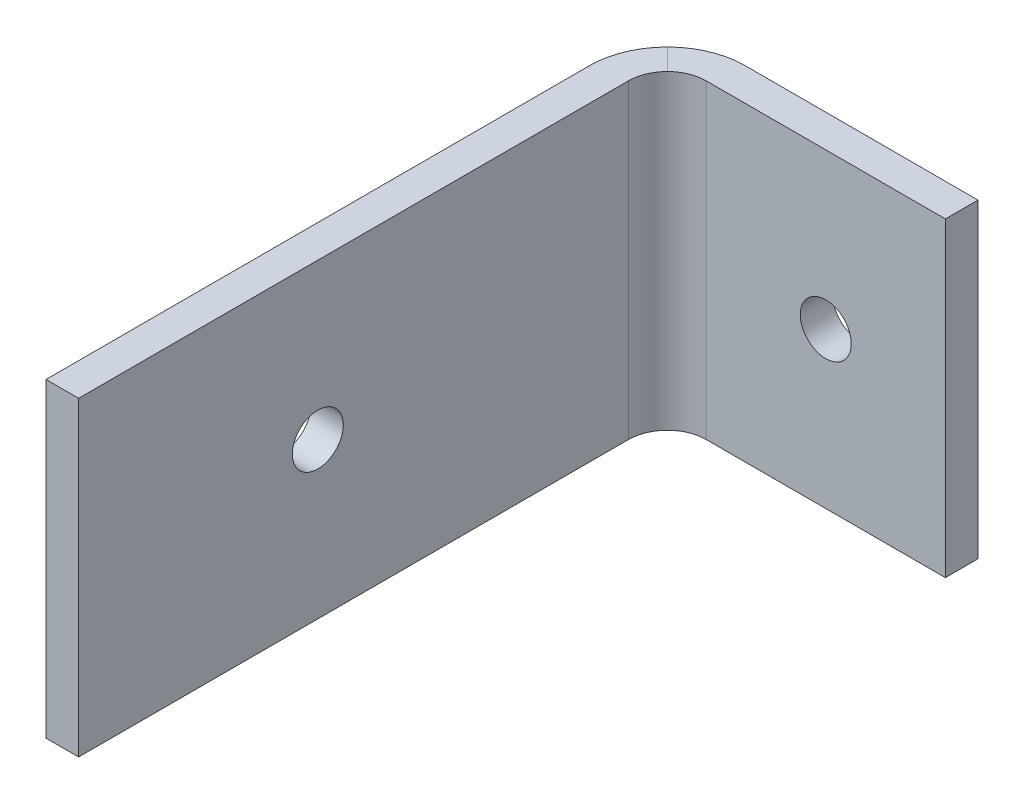
ISO-10303-21;
HEADER;
FILE_DESCRIPTION(('STEP AP214'),'2;1');
FILE_NAME('part.step','',(''),(''),'','','');
FILE_SCHEMA(('AUTOMOTIVE_DESIGN { 1 0 10303 214 1 1 1 1 }'));
ENDSEC;
DATA;
#1=APPLICATION_CONTEXT('core data for automotive mechanical design processes');
#2=APPLICATION_PROTOCOL_DEFINITION('international standard','automotive_design',2000,#1);
#3=PRODUCT_CONTEXT('',#1,'mechanical');
#4=PRODUCT('Part','Part','',(#3));
#5=PRODUCT_RELATED_PRODUCT_CATEGORY('part','',(#4));
#6=PRODUCT_DEFINITION_FORMATION('','',#4);
#7=PRODUCT_DEFINITION_CONTEXT('part definition',#1,'design');
#8=PRODUCT_DEFINITION('design','',#6,#7);
#9=PRODUCT_DEFINITION_SHAPE('','',#8);
#10=(LENGTH_UNIT() NAMED_UNIT(*) SI_UNIT(.MILLI.,.METRE.));
#11=(NAMED_UNIT(*) PLANE_ANGLE_UNIT() SI_UNIT($,.RADIAN.));
#12=(NAMED_UNIT(*) SI_UNIT($,.STERADIAN.) SOLID_ANGLE_UNIT());
#13=UNCERTAINTY_MEASURE_WITH_UNIT(LENGTH_MEASURE(1.E-05),#10,'distance_accuracy_value','');
#14=(GEOMETRIC_REPRESENTATION_CONTEXT(3) GLOBAL_UNCERTAINTY_ASSIGNED_CONTEXT((#13)) GLOBAL_UNIT_ASSIGNED_CONTEXT((#10,
#11,#12)) REPRESENTATION_CONTEXT('',''));
#15=CARTESIAN_POINT('',(0.,0.,0.));
#16=DIRECTION('',(0.,0.,1.));
#17=DIRECTION('',(1.,0.,0.));
#18=AXIS2_PLACEMENT_3D('',#15,#16,#17);
#19=CARTESIAN_POINT('',(25.4,0.,-50.8));
#20=DIRECTION('',(-1.,0.,0.));
#21=DIRECTION('',(0.,0.,1.));
#22=AXIS2_PLACEMENT_3D('',#19,#20,#21);
#23=PLANE('',#22);
#24=DIRECTION('',(0.,1.,0.));
#25=VECTOR('',#24,1.);
#26=CARTESIAN_POINT('',(25.4,-12.7,-48.133));
#27=LINE('',#26,#25);
#28=CARTESIAN_POINT('',(25.4,-12.7,-48.133));
#29=VERTEX_POINT('',#28);
#30=CARTESIAN_POINT('',(25.4,12.7,-48.133));
#31=VERTEX_POINT('',#30);
#32=EDGE_CURVE('E167',#29,#31,#27,.T.);
#33=ORIENTED_EDGE('',*,*,#32,.F.);
#34=DIRECTION('',(0.,0.,1.));
#35=VECTOR('',#34,1.);
#36=CARTESIAN_POINT('',(25.4,-12.7,-48.133));
#37=LINE('',#36,#35);
#38=CARTESIAN_POINT('',(25.4,-12.7,-50.8));
#39=VERTEX_POINT('',#38);
#40=EDGE_CURVE('E153',#39,#29,#37,.T.);
#41=ORIENTED_EDGE('',*,*,#40,.F.);
#42=DIRECTION('',(0.,-1.,0.));
#43=VECTOR('',#42,1.);
#44=CARTESIAN_POINT('',(25.4,-12.7,-50.8));
#45=LINE('',#44,#43);
#46=CARTESIAN_POINT('',(25.4,12.7,-50.8));
#47=VERTEX_POINT('',#46);
#48=EDGE_CURVE('E158',#47,#39,#45,.T.);
#49=ORIENTED_EDGE('',*,*,#48,.F.);
#50=DIRECTION('',(0.,0.,-1.));
#51=VECTOR('',#50,1.);
#52=CARTESIAN_POINT('',(25.4,12.7,-48.133));
#53=LINE('',#52,#51);
#54=EDGE_CURVE('E163',#31,#47,#53,.T.);
#55=ORIENTED_EDGE('',*,*,#54,.F.);
#56=EDGE_LOOP('',(#33,#41,#49,#55));
#57=FACE_BOUND('',#56,.T.);
#58=ADVANCED_FACE('F34',(#57),#23,.F.);
#59=CARTESIAN_POINT('',(0.,0.,0.));
#60=DIRECTION('',(0.,0.,1.));
#61=DIRECTION('',(1.,0.,0.));
#62=AXIS2_PLACEMENT_3D('',#59,#60,#61);
#63=PLANE('',#62);
#64=DIRECTION('',(0.,1.,0.));
#65=VECTOR('',#64,1.);
#66=CARTESIAN_POINT('',(2.667,-12.7,0.));
#67=LINE('',#66,#65);
#68=CARTESIAN_POINT('',(2.667,-12.7,0.));
#69=VERTEX_POINT('',#68);
#70=CARTESIAN_POINT('',(2.667,12.7,0.));
#71=VERTEX_POINT('',#70);
#72=EDGE_CURVE('E144',#69,#71,#67,.T.);
#73=ORIENTED_EDGE('',*,*,#72,.T.);
#74=DIRECTION('',(-1.,0.,0.));
#75=VECTOR('',#74,1.);
#76=CARTESIAN_POINT('',(2.667,12.7,0.));
#77=LINE('',#76,#75);
#78=CARTESIAN_POINT('',(0.,12.7,0.));
#79=VERTEX_POINT('',#78);
#80=EDGE_CURVE('E125',#71,#79,#77,.T.);
#81=ORIENTED_EDGE('',*,*,#80,.T.);
#82=DIRECTION('',(0.,-1.,0.));
#83=VECTOR('',#82,1.);
#84=CARTESIAN_POINT('',(0.,-12.7,0.));
#85=LINE('',#84,#83);
#86=CARTESIAN_POINT('',(0.,-12.7,0.));
#87=VERTEX_POINT('',#86);
#88=EDGE_CURVE('E121',#79,#87,#85,.T.);
#89=ORIENTED_EDGE('',*,*,#88,.T.);
#90=DIRECTION('',(1.,0.,0.));
#91=VECTOR('',#90,1.);
#92=CARTESIAN_POINT('',(2.667,-12.7,0.));
#93=LINE('',#92,#91);
#94=EDGE_CURVE('E112',#87,#69,#93,.T.);
#95=ORIENTED_EDGE('',*,*,#94,.T.);
#96=EDGE_LOOP('',(#73,#81,#89,#95));
#97=FACE_BOUND('',#96,.T.);
#98=ADVANCED_FACE('F124',(#97),#63,.T.);
#99=CARTESIAN_POINT('',(0.,-12.7,-48.133));
#100=DIRECTION('',(0.,0.,-1.));
#101=DIRECTION('',(0.,1.,0.));
#102=AXIS2_PLACEMENT_3D('',#99,#100,#101);
#103=PLANE('',#102);
#104=CARTESIAN_POINT('',(15.621,0.,-48.133));
#105=DIRECTION('',(0.,0.,1.));
#106=DIRECTION('',(1.,0.,0.));
#107=AXIS2_PLACEMENT_3D('',#104,#105,#106);
#108=CIRCLE('',#107,2.0828);
#109=CARTESIAN_POINT('',(17.7038,0.,-48.133));
#110=VERTEX_POINT('',#109);
#111=EDGE_CURVE('E268',#110,#110,#108,.T.);
#112=ORIENTED_EDGE('',*,*,#111,.F.);
#113=EDGE_LOOP('',(#112));
#114=FACE_BOUND('',#113,.T.);
#115=DIRECTION('',(1.,0.,0.));
#116=VECTOR('',#115,1.);
#117=CARTESIAN_POINT('',(0.,12.7,-48.133));
#118=LINE('',#117,#116);
#119=CARTESIAN_POINT('',(5.842,12.7,-48.133));
#120=VERTEX_POINT('',#119);
#121=EDGE_CURVE('E166',#120,#31,#118,.T.);
#122=ORIENTED_EDGE('',*,*,#121,.F.);
#123=DIRECTION('',(0.,-1.,0.));
#124=VECTOR('',#123,1.);
#125=CARTESIAN_POINT('',(5.842,-12.7,-48.133));
#126=LINE('',#125,#124);
#127=CARTESIAN_POINT('',(5.842,-12.7,-48.133));
#128=VERTEX_POINT('',#127);
#129=EDGE_CURVE('E145',#120,#128,#126,.T.);
#130=ORIENTED_EDGE('',*,*,#129,.T.);
#131=DIRECTION('',(1.,0.,0.));
#132=VECTOR('',#131,1.);
#133=CARTESIAN_POINT('',(0.,-12.7,-48.133));
#134=LINE('',#133,#132);
#135=EDGE_CURVE('E149',#128,#29,#134,.T.);
#136=ORIENTED_EDGE('',*,*,#135,.T.);
#137=ORIENTED_EDGE('',*,*,#32,.T.);
#138=EDGE_LOOP('',(#122,#130,#136,#137));
#139=FACE_BOUND('',#138,.T.);
#140=ADVANCED_FACE('F209',(#114,#139),#103,.F.);
#141=CARTESIAN_POINT('',(0.,12.7,-48.133));
#142=DIRECTION('',(0.,-1.,0.));
#143=DIRECTION('',(0.,0.,-1.));
#144=AXIS2_PLACEMENT_3D('',#141,#142,#143);
#145=PLANE('',#144);
#146=DIRECTION('',(1.,0.,0.));
#147=VECTOR('',#146,1.);
#148=CARTESIAN_POINT('',(0.,12.7,-50.8));
#149=LINE('',#148,#147);
#150=CARTESIAN_POINT('',(6.35,12.7,-50.8));
#151=VERTEX_POINT('',#150);
#152=EDGE_CURVE('E161',#151,#47,#149,.T.);
#153=ORIENTED_EDGE('',*,*,#152,.F.);
#154=CARTESIAN_POINT('',(6.35,12.7,-44.45));
#155=DIRECTION('',(0.,-1.,0.));
#156=DIRECTION('',(0.,0.,-1.));
#157=AXIS2_PLACEMENT_3D('',#154,#155,#156);
#158=CIRCLE('',#157,6.35);
#159=CARTESIAN_POINT('',(1.85987193946542,12.7,-48.9401280605346));
#160=VERTEX_POINT('',#159);
#161=EDGE_CURVE('E43',#151,#160,#158,.F.);
#162=ORIENTED_EDGE('',*,*,#161,.T.);
#163=DIRECTION('',(0.707106781186548,0.,0.707106781186548));
#164=VECTOR('',#163,1.);
#165=CARTESIAN_POINT('',(26.7335,12.7,-24.0665));
#166=LINE('',#165,#164);
#167=CARTESIAN_POINT('',(3.59693596973271,12.7,-47.2030640302673));
#168=VERTEX_POINT('',#167);
#169=EDGE_CURVE('E135',#160,#168,#166,.T.);
#170=ORIENTED_EDGE('',*,*,#169,.T.);
#171=CARTESIAN_POINT('',(5.842,12.7,-44.958));
#172=DIRECTION('',(0.,-1.,0.));
#173=DIRECTION('',(0.,0.,-1.));
#174=AXIS2_PLACEMENT_3D('',#171,#172,#173);
#175=CIRCLE('',#174,3.175);
#176=EDGE_CURVE('E184',#168,#120,#175,.T.);
#177=ORIENTED_EDGE('',*,*,#176,.T.);
#178=ORIENTED_EDGE('',*,*,#121,.T.);
#179=ORIENTED_EDGE('',*,*,#54,.T.);
#180=EDGE_LOOP('',(#153,#162,#170,#177,#178,#179));
#181=FACE_BOUND('',#180,.T.);
#182=ADVANCED_FACE('F204',(#181),#145,.F.);
#183=CARTESIAN_POINT('',(0.,-12.7,-50.8));
#184=DIRECTION('',(0.,0.,1.));
#185=DIRECTION('',(0.,-1.,0.));
#186=AXIS2_PLACEMENT_3D('',#183,#184,#185);
#187=PLANE('',#186);
#188=CARTESIAN_POINT('',(15.621,0.,-50.8));
#189=DIRECTION('',(0.,0.,1.));
#190=DIRECTION('',(1.,0.,0.));
#191=AXIS2_PLACEMENT_3D('',#188,#189,#190);
#192=CIRCLE('',#191,2.0828);
#193=CARTESIAN_POINT('',(17.7038,0.,-50.8));
#194=VERTEX_POINT('',#193);
#195=EDGE_CURVE('E265',#194,#194,#192,.T.);
#196=ORIENTED_EDGE('',*,*,#195,.T.);
#197=EDGE_LOOP('',(#196));
#198=FACE_BOUND('',#197,.T.);
#199=DIRECTION('',(1.,0.,0.));
#200=VECTOR('',#199,1.);
#201=CARTESIAN_POINT('',(0.,-12.7,-50.8));
#202=LINE('',#201,#200);
#203=CARTESIAN_POINT('',(6.35,-12.7,-50.8));
#204=VERTEX_POINT('',#203);
#205=EDGE_CURVE('E156',#204,#39,#202,.T.);
#206=ORIENTED_EDGE('',*,*,#205,.F.);
#207=DIRECTION('',(0.,-1.,0.));
#208=VECTOR('',#207,1.);
#209=CARTESIAN_POINT('',(6.35,-12.7,-50.8));
#210=LINE('',#209,#208);
#211=EDGE_CURVE('E57',#204,#151,#210,.F.);
#212=ORIENTED_EDGE('',*,*,#211,.T.);
#213=ORIENTED_EDGE('',*,*,#152,.T.);
#214=ORIENTED_EDGE('',*,*,#48,.T.);
#215=EDGE_LOOP('',(#206,#212,#213,#214));
#216=FACE_BOUND('',#215,.T.);
#217=ADVANCED_FACE('F196',(#198,#216),#187,.F.);
#218=CARTESIAN_POINT('',(0.,-12.7,-48.133));
#219=DIRECTION('',(0.,1.,0.));
#220=DIRECTION('',(0.,0.,1.));
#221=AXIS2_PLACEMENT_3D('',#218,#219,#220);
#222=PLANE('',#221);
#223=DIRECTION('',(-0.707106781186548,0.,-0.707106781186548));
#224=VECTOR('',#223,1.);
#225=CARTESIAN_POINT('',(26.7335,-12.7,-24.0665));
#226=LINE('',#225,#224);
#227=CARTESIAN_POINT('',(3.59693596973271,-12.7,-47.2030640302673));
#228=VERTEX_POINT('',#227);
#229=CARTESIAN_POINT('',(1.85987193946543,-12.7,-48.9401280605346));
#230=VERTEX_POINT('',#229);
#231=EDGE_CURVE('E139',#228,#230,#226,.T.);
#232=ORIENTED_EDGE('',*,*,#231,.T.);
#233=CARTESIAN_POINT('',(6.35,-12.7,-44.45));
#234=DIRECTION('',(0.,1.,0.));
#235=DIRECTION('',(0.,0.,1.));
#236=AXIS2_PLACEMENT_3D('',#233,#234,#235);
#237=CIRCLE('',#236,6.35);
#238=EDGE_CURVE('E189',#230,#204,#237,.F.);
#239=ORIENTED_EDGE('',*,*,#238,.T.);
#240=ORIENTED_EDGE('',*,*,#205,.T.);
#241=ORIENTED_EDGE('',*,*,#40,.T.);
#242=ORIENTED_EDGE('',*,*,#135,.F.);
#243=CARTESIAN_POINT('',(5.842,-12.7,-44.958));
#244=DIRECTION('',(0.,1.,0.));
#245=DIRECTION('',(0.,0.,1.));
#246=AXIS2_PLACEMENT_3D('',#243,#244,#245);
#247=CIRCLE('',#246,3.175);
#248=EDGE_CURVE('E176',#128,#228,#247,.T.);
#249=ORIENTED_EDGE('',*,*,#248,.T.);
#250=EDGE_LOOP('',(#232,#239,#240,#241,#242,#249));
#251=FACE_BOUND('',#250,.T.);
#252=ADVANCED_FACE('F194',(#251),#222,.F.);
#253=CARTESIAN_POINT('',(0.,-12.7,0.));
#254=DIRECTION('',(1.,0.,0.));
#255=DIRECTION('',(0.,1.,0.));
#256=AXIS2_PLACEMENT_3D('',#253,#254,#255);
#257=PLANE('',#256);
#258=CARTESIAN_POINT('',(0.,0.,-19.558));
#259=DIRECTION('',(1.,0.,0.));
#260=DIRECTION('',(0.,1.,0.));
#261=AXIS2_PLACEMENT_3D('',#258,#259,#260);
#262=CIRCLE('',#261,2.0828);
#263=CARTESIAN_POINT('',(0.,2.0828,-19.558));
#264=VERTEX_POINT('',#263);
#265=EDGE_CURVE('E270',#264,#264,#262,.T.);
#266=ORIENTED_EDGE('',*,*,#265,.T.);
#267=EDGE_LOOP('',(#266));
#268=FACE_BOUND('',#267,.T.);
#269=DIRECTION('',(0.,0.,-1.));
#270=VECTOR('',#269,1.);
#271=CARTESIAN_POINT('',(0.,12.7,0.));
#272=LINE('',#271,#270);
#273=CARTESIAN_POINT('',(0.,12.7,-44.45));
#274=VERTEX_POINT('',#273);
#275=EDGE_CURVE('E134',#79,#274,#272,.T.);
#276=ORIENTED_EDGE('',*,*,#275,.T.);
#277=DIRECTION('',(0.,-1.,0.));
#278=VECTOR('',#277,1.);
#279=CARTESIAN_POINT('',(0.,-12.7,-44.45));
#280=LINE('',#279,#278);
#281=CARTESIAN_POINT('',(0.,-12.7,-44.45));
#282=VERTEX_POINT('',#281);
#283=EDGE_CURVE('E133',#274,#282,#280,.T.);
#284=ORIENTED_EDGE('',*,*,#283,.T.);
#285=DIRECTION('',(0.,0.,-1.));
#286=VECTOR('',#285,1.);
#287=CARTESIAN_POINT('',(0.,-12.7,0.));
#288=LINE('',#287,#286);
#289=EDGE_CURVE('E116',#87,#282,#288,.T.);
#290=ORIENTED_EDGE('',*,*,#289,.F.);
#291=ORIENTED_EDGE('',*,*,#88,.F.);
#292=EDGE_LOOP('',(#276,#284,#290,#291));
#293=FACE_BOUND('',#292,.T.);
#294=ADVANCED_FACE('F131',(#268,#293),#257,.F.);
#295=CARTESIAN_POINT('',(2.667,-12.7,0.));
#296=DIRECTION('',(-1.,0.,0.));
#297=DIRECTION('',(0.,-1.,0.));
#298=AXIS2_PLACEMENT_3D('',#295,#296,#297);
#299=PLANE('',#298);
#300=CARTESIAN_POINT('',(2.667,0.,-19.558));
#301=DIRECTION('',(-1.,0.,0.));
#302=DIRECTION('',(0.,-1.,0.));
#303=AXIS2_PLACEMENT_3D('',#300,#301,#302);
#304=CIRCLE('',#303,2.0828);
#305=CARTESIAN_POINT('',(2.667,-2.0828,-19.558));
#306=VERTEX_POINT('',#305);
#307=EDGE_CURVE('E38',#306,#306,#304,.F.);
#308=ORIENTED_EDGE('',*,*,#307,.F.);
#309=EDGE_LOOP('',(#308));
#310=FACE_BOUND('',#309,.T.);
#311=DIRECTION('',(0.,0.,-1.));
#312=VECTOR('',#311,1.);
#313=CARTESIAN_POINT('',(2.667,-12.7,0.));
#314=LINE('',#313,#312);
#315=CARTESIAN_POINT('',(2.667,-12.7,-44.958));
#316=VERTEX_POINT('',#315);
#317=EDGE_CURVE('E118',#69,#316,#314,.T.);
#318=ORIENTED_EDGE('',*,*,#317,.T.);
#319=DIRECTION('',(0.,-1.,0.));
#320=VECTOR('',#319,1.);
#321=CARTESIAN_POINT('',(2.667,12.7,-44.958));
#322=LINE('',#321,#320);
#323=CARTESIAN_POINT('',(2.667,12.7,-44.958));
#324=VERTEX_POINT('',#323);
#325=EDGE_CURVE('E174',#316,#324,#322,.F.);
#326=ORIENTED_EDGE('',*,*,#325,.T.);
#327=DIRECTION('',(0.,0.,-1.));
#328=VECTOR('',#327,1.);
#329=CARTESIAN_POINT('',(2.667,12.7,0.));
#330=LINE('',#329,#328);
#331=EDGE_CURVE('E137',#71,#324,#330,.T.);
#332=ORIENTED_EDGE('',*,*,#331,.F.);
#333=ORIENTED_EDGE('',*,*,#72,.F.);
#334=EDGE_LOOP('',(#318,#326,#332,#333));
#335=FACE_BOUND('',#334,.T.);
#336=ADVANCED_FACE('F229',(#310,#335),#299,.F.);
#337=CARTESIAN_POINT('',(2.667,12.7,0.));
#338=DIRECTION('',(0.,-1.,0.));
#339=DIRECTION('',(0.,0.,-1.));
#340=AXIS2_PLACEMENT_3D('',#337,#338,#339);
#341=PLANE('',#340);
#342=ORIENTED_EDGE('',*,*,#169,.F.);
#343=CARTESIAN_POINT('',(6.35,12.7,-44.45));
#344=DIRECTION('',(0.,-1.,0.));
#345=DIRECTION('',(0.,0.,-1.));
#346=AXIS2_PLACEMENT_3D('',#343,#344,#345);
#347=CIRCLE('',#346,6.35);
#348=EDGE_CURVE('E11',#160,#274,#347,.F.);
#349=ORIENTED_EDGE('',*,*,#348,.T.);
#350=ORIENTED_EDGE('',*,*,#275,.F.);
#351=ORIENTED_EDGE('',*,*,#80,.F.);
#352=ORIENTED_EDGE('',*,*,#331,.T.);
#353=CARTESIAN_POINT('',(5.842,12.7,-44.958));
#354=DIRECTION('',(0.,-1.,0.));
#355=DIRECTION('',(0.,0.,-1.));
#356=AXIS2_PLACEMENT_3D('',#353,#354,#355);
#357=CIRCLE('',#356,3.175);
#358=EDGE_CURVE('E181',#324,#168,#357,.T.);
#359=ORIENTED_EDGE('',*,*,#358,.T.);
#360=EDGE_LOOP('',(#342,#349,#350,#351,#352,#359));
#361=FACE_BOUND('',#360,.T.);
#362=ADVANCED_FACE('F201',(#361),#341,.F.);
#363=CARTESIAN_POINT('',(2.667,-12.7,0.));
#364=DIRECTION('',(0.,1.,0.));
#365=DIRECTION('',(0.,0.,1.));
#366=AXIS2_PLACEMENT_3D('',#363,#364,#365);
#367=PLANE('',#366);
#368=ORIENTED_EDGE('',*,*,#289,.T.);
#369=CARTESIAN_POINT('',(6.35,-12.7,-44.45));
#370=DIRECTION('',(0.,1.,0.));
#371=DIRECTION('',(0.,0.,1.));
#372=AXIS2_PLACEMENT_3D('',#369,#370,#371);
#373=CIRCLE('',#372,6.35);
#374=EDGE_CURVE('E187',#282,#230,#373,.F.);
#375=ORIENTED_EDGE('',*,*,#374,.T.);
#376=ORIENTED_EDGE('',*,*,#231,.F.);
#377=CARTESIAN_POINT('',(5.842,-12.7,-44.958));
#378=DIRECTION('',(0.,1.,0.));
#379=DIRECTION('',(0.,0.,1.));
#380=AXIS2_PLACEMENT_3D('',#377,#378,#379);
#381=CIRCLE('',#380,3.175);
#382=EDGE_CURVE('E179',#228,#316,#381,.T.);
#383=ORIENTED_EDGE('',*,*,#382,.T.);
#384=ORIENTED_EDGE('',*,*,#317,.F.);
#385=ORIENTED_EDGE('',*,*,#94,.F.);
#386=EDGE_LOOP('',(#368,#375,#376,#383,#384,#385));
#387=FACE_BOUND('',#386,.T.);
#388=ADVANCED_FACE('F114',(#387),#367,.F.);
#389=CARTESIAN_POINT('',(5.842,-12.7,-44.958));
#390=DIRECTION('',(0.,1.,0.));
#391=DIRECTION('',(0.,0.,1.));
#392=AXIS2_PLACEMENT_3D('',#389,#390,#391);
#393=CYLINDRICAL_SURFACE('',#392,3.175);
#394=ORIENTED_EDGE('',*,*,#358,.F.);
#395=ORIENTED_EDGE('',*,*,#325,.F.);
#396=ORIENTED_EDGE('',*,*,#382,.F.);
#397=ORIENTED_EDGE('',*,*,#248,.F.);
#398=ORIENTED_EDGE('',*,*,#129,.F.);
#399=ORIENTED_EDGE('',*,*,#176,.F.);
#400=EDGE_LOOP('',(#394,#395,#396,#397,#398,#399));
#401=FACE_BOUND('',#400,.T.);
#402=ADVANCED_FACE('F213',(#401),#393,.F.);
#403=CARTESIAN_POINT('',(6.35,-12.7,-44.45));
#404=DIRECTION('',(0.,-1.,0.));
#405=DIRECTION('',(0.,0.,-1.));
#406=AXIS2_PLACEMENT_3D('',#403,#404,#405);
#407=CYLINDRICAL_SURFACE('',#406,6.35);
#408=ORIENTED_EDGE('',*,*,#161,.F.);
#409=ORIENTED_EDGE('',*,*,#211,.F.);
#410=ORIENTED_EDGE('',*,*,#238,.F.);
#411=ORIENTED_EDGE('',*,*,#374,.F.);
#412=ORIENTED_EDGE('',*,*,#283,.F.);
#413=ORIENTED_EDGE('',*,*,#348,.F.);
#414=EDGE_LOOP('',(#408,#409,#410,#411,#412,#413));
#415=FACE_BOUND('',#414,.T.);
#416=ADVANCED_FACE('F36',(#415),#407,.T.);
#417=CARTESIAN_POINT('',(2.921,0.,-19.558));
#418=DIRECTION('',(-1.,0.,0.));
#419=DIRECTION('',(0.,-1.,0.));
#420=AXIS2_PLACEMENT_3D('',#417,#418,#419);
#421=CYLINDRICAL_SURFACE('',#420,2.0828);
#422=ORIENTED_EDGE('',*,*,#265,.F.);
#423=EDGE_LOOP('',(#422));
#424=FACE_BOUND('',#423,.T.);
#425=ORIENTED_EDGE('',*,*,#307,.T.);
#426=EDGE_LOOP('',(#425));
#427=FACE_BOUND('',#426,.T.);
#428=ADVANCED_FACE('F253',(#424,#427),#421,.F.);
#429=CARTESIAN_POINT('',(15.621,0.,-50.8));
#430=DIRECTION('',(0.,0.,1.));
#431=DIRECTION('',(1.,0.,0.));
#432=AXIS2_PLACEMENT_3D('',#429,#430,#431);
#433=CYLINDRICAL_SURFACE('',#432,2.0828);
#434=ORIENTED_EDGE('',*,*,#195,.F.);
#435=EDGE_LOOP('',(#434));
#436=FACE_BOUND('',#435,.T.);
#437=ORIENTED_EDGE('',*,*,#111,.T.);
#438=EDGE_LOOP('',(#437));
#439=FACE_BOUND('',#438,.T.);
#440=ADVANCED_FACE('F256',(#436,#439),#433,.F.);
#441=CLOSED_SHELL('',(#58,#98,#140,#182,#217,#252,#294,#336,#362,#388,#402,#416,#428,#440));
#442=MANIFOLD_SOLID_BREP('B2',#441);
#443=ADVANCED_BREP_SHAPE_REPRESENTATION('',(#18,#442),#14);
#444=SHAPE_DEFINITION_REPRESENTATION(#9,#443);
ENDSEC;
END-ISO-10303-21;
